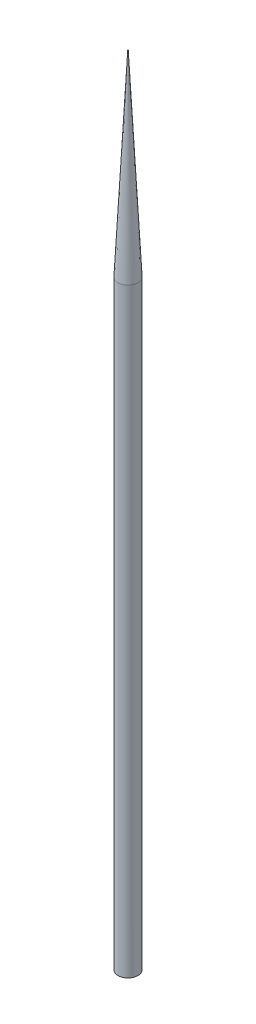
ISO-10303-21;
HEADER;
FILE_DESCRIPTION(('STEP AP214'),'2;1');
FILE_NAME('part.step','',(''),(''),'','','');
FILE_SCHEMA(('AUTOMOTIVE_DESIGN { 1 0 10303 214 1 1 1 1 }'));
ENDSEC;
DATA;
#1=APPLICATION_CONTEXT('core data for automotive mechanical design processes');
#2=APPLICATION_PROTOCOL_DEFINITION('international standard','automotive_design',2000,#1);
#3=PRODUCT_CONTEXT('',#1,'mechanical');
#4=PRODUCT('Part','Part','',(#3));
#5=PRODUCT_RELATED_PRODUCT_CATEGORY('part','',(#4));
#6=PRODUCT_DEFINITION_FORMATION('','',#4);
#7=PRODUCT_DEFINITION_CONTEXT('part definition',#1,'design');
#8=PRODUCT_DEFINITION('design','',#6,#7);
#9=PRODUCT_DEFINITION_SHAPE('','',#8);
#10=(LENGTH_UNIT() NAMED_UNIT(*) SI_UNIT(.MILLI.,.METRE.));
#11=(NAMED_UNIT(*) PLANE_ANGLE_UNIT() SI_UNIT($,.RADIAN.));
#12=(NAMED_UNIT(*) SI_UNIT($,.STERADIAN.) SOLID_ANGLE_UNIT());
#13=UNCERTAINTY_MEASURE_WITH_UNIT(LENGTH_MEASURE(1.E-05),#10,'distance_accuracy_value','');
#14=(GEOMETRIC_REPRESENTATION_CONTEXT(3) GLOBAL_UNCERTAINTY_ASSIGNED_CONTEXT((#13)) GLOBAL_UNIT_ASSIGNED_CONTEXT((#10,
#11,#12)) REPRESENTATION_CONTEXT('',''));
#15=CARTESIAN_POINT('',(0.,0.,0.));
#16=DIRECTION('',(0.,0.,1.));
#17=DIRECTION('',(1.,0.,0.));
#18=AXIS2_PLACEMENT_3D('',#15,#16,#17);
#19=CARTESIAN_POINT('',(0.,-15.7638550771599,0.));
#20=DIRECTION('',(0.,1.,0.));
#21=DIRECTION('',(0.,0.,1.));
#22=AXIS2_PLACEMENT_3D('',#19,#20,#21);
#23=PLANE('',#22);
#24=CARTESIAN_POINT('',(0.,-15.7638550771599,0.));
#25=DIRECTION('',(0.,1.,0.));
#26=DIRECTION('',(0.,0.,1.));
#27=AXIS2_PLACEMENT_3D('',#24,#25,#26);
#28=CIRCLE('',#27,0.35);
#29=CARTESIAN_POINT('',(0.,-15.7638550771599,0.35));
#30=VERTEX_POINT('',#29);
#31=EDGE_CURVE('E45',#30,#30,#28,.T.);
#32=ORIENTED_EDGE('',*,*,#31,.F.);
#33=EDGE_LOOP('',(#32));
#34=FACE_BOUND('',#33,.T.);
#35=ADVANCED_FACE('F39',(#34),#23,.F.);
#36=CARTESIAN_POINT('',(0.,-15.7638550771599,0.));
#37=DIRECTION('',(0.,1.,0.));
#38=DIRECTION('',(0.,0.,1.));
#39=AXIS2_PLACEMENT_3D('',#36,#37,#38);
#40=CYLINDRICAL_SURFACE('',#39,0.35);
#41=CARTESIAN_POINT('',(0.,5.23614492284013,0.));
#42=DIRECTION('',(0.,1.,0.));
#43=DIRECTION('',(0.,0.,1.));
#44=AXIS2_PLACEMENT_3D('',#41,#42,#43);
#45=CIRCLE('',#44,0.35);
#46=CARTESIAN_POINT('',(0.,5.23614492284013,0.35));
#47=VERTEX_POINT('',#46);
#48=EDGE_CURVE('E11',#47,#47,#45,.T.);
#49=ORIENTED_EDGE('',*,*,#48,.F.);
#50=EDGE_LOOP('',(#49));
#51=FACE_BOUND('',#50,.T.);
#52=ORIENTED_EDGE('',*,*,#31,.T.);
#53=EDGE_LOOP('',(#52));
#54=FACE_BOUND('',#53,.T.);
#55=ADVANCED_FACE('F51',(#51,#54),#40,.T.);
#56=CARTESIAN_POINT('',(0.,5.23614492284013,0.));
#57=DIRECTION('',(0.,-1.,0.));
#58=DIRECTION('',(0.,0.,-1.));
#59=AXIS2_PLACEMENT_3D('',#56,#57,#58);
#60=CONICAL_SURFACE('',#59,0.35,0.0499583957219428);
#61=CARTESIAN_POINT('',(0.,12.2361449228401,0.));
#62=VERTEX_POINT('',#61);
#63=VERTEX_LOOP('',#62);
#64=FACE_BOUND('',#63,.T.);
#65=ORIENTED_EDGE('',*,*,#48,.T.);
#66=EDGE_LOOP('',(#65));
#67=FACE_BOUND('',#66,.T.);
#68=ADVANCED_FACE('F48',(#64,#67),#60,.T.);
#69=CLOSED_SHELL('',(#35,#55,#68));
#70=MANIFOLD_SOLID_BREP('B2',#69);
#71=ADVANCED_BREP_SHAPE_REPRESENTATION('',(#18,#70),#14);
#72=SHAPE_DEFINITION_REPRESENTATION(#9,#71);
ENDSEC;
END-ISO-10303-21;
